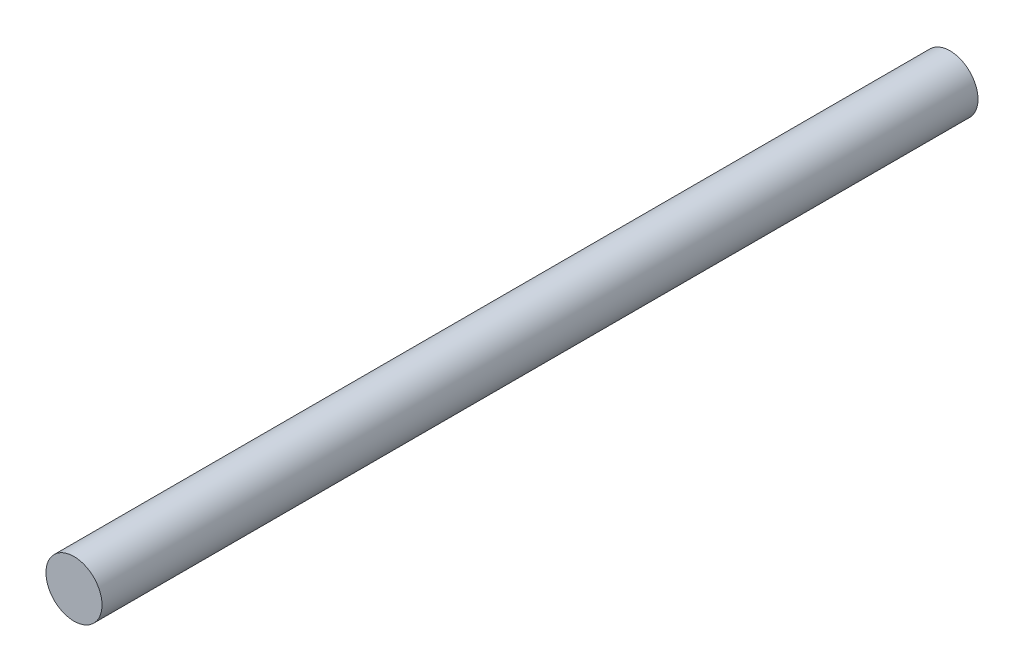
ISO-10303-21;
HEADER;
FILE_DESCRIPTION(('STEP AP214'),'2;1');
FILE_NAME('part.step','',(''),(''),'','','');
FILE_SCHEMA(('AUTOMOTIVE_DESIGN { 1 0 10303 214 1 1 1 1 }'));
ENDSEC;
DATA;
#1=APPLICATION_CONTEXT('core data for automotive mechanical design processes');
#2=APPLICATION_PROTOCOL_DEFINITION('international standard','automotive_design',2000,#1);
#3=PRODUCT_CONTEXT('',#1,'mechanical');
#4=PRODUCT('Part','Part','',(#3));
#5=PRODUCT_RELATED_PRODUCT_CATEGORY('part','',(#4));
#6=PRODUCT_DEFINITION_FORMATION('','',#4);
#7=PRODUCT_DEFINITION_CONTEXT('part definition',#1,'design');
#8=PRODUCT_DEFINITION('design','',#6,#7);
#9=PRODUCT_DEFINITION_SHAPE('','',#8);
#10=(LENGTH_UNIT() NAMED_UNIT(*) SI_UNIT(.MILLI.,.METRE.));
#11=(NAMED_UNIT(*) PLANE_ANGLE_UNIT() SI_UNIT($,.RADIAN.));
#12=(NAMED_UNIT(*) SI_UNIT($,.STERADIAN.) SOLID_ANGLE_UNIT());
#13=UNCERTAINTY_MEASURE_WITH_UNIT(LENGTH_MEASURE(1.E-05),#10,'distance_accuracy_value','');
#14=(GEOMETRIC_REPRESENTATION_CONTEXT(3) GLOBAL_UNCERTAINTY_ASSIGNED_CONTEXT((#13)) GLOBAL_UNIT_ASSIGNED_CONTEXT((#10,
#11,#12)) REPRESENTATION_CONTEXT('',''));
#15=CARTESIAN_POINT('',(0.,0.,0.));
#16=DIRECTION('',(0.,0.,1.));
#17=DIRECTION('',(1.,0.,0.));
#18=AXIS2_PLACEMENT_3D('',#15,#16,#17);
#19=CARTESIAN_POINT('',(0.,0.,50.));
#20=DIRECTION('',(0.,0.,-1.));
#21=DIRECTION('',(-1.,0.,0.));
#22=AXIS2_PLACEMENT_3D('',#19,#20,#21);
#23=CYLINDRICAL_SURFACE('',#22,1.6);
#24=CARTESIAN_POINT('',(0.,0.,50.));
#25=DIRECTION('',(0.,0.,1.));
#26=DIRECTION('',(1.,0.,0.));
#27=AXIS2_PLACEMENT_3D('',#24,#25,#26);
#28=CIRCLE('',#27,1.6);
#29=CARTESIAN_POINT('',(1.6,0.,50.));
#30=VERTEX_POINT('',#29);
#31=EDGE_CURVE('E10',#30,#30,#28,.T.);
#32=ORIENTED_EDGE('',*,*,#31,.F.);
#33=EDGE_LOOP('',(#32));
#34=FACE_BOUND('',#33,.T.);
#35=CARTESIAN_POINT('',(0.,0.,0.));
#36=DIRECTION('',(0.,0.,1.));
#37=DIRECTION('',(1.,0.,0.));
#38=AXIS2_PLACEMENT_3D('',#35,#36,#37);
#39=CIRCLE('',#38,1.6);
#40=CARTESIAN_POINT('',(1.6,0.,0.));
#41=VERTEX_POINT('',#40);
#42=EDGE_CURVE('E42',#41,#41,#39,.T.);
#43=ORIENTED_EDGE('',*,*,#42,.T.);
#44=EDGE_LOOP('',(#43));
#45=FACE_BOUND('',#44,.T.);
#46=ADVANCED_FACE('F39',(#34,#45),#23,.T.);
#47=CARTESIAN_POINT('',(0.,0.,50.));
#48=DIRECTION('',(0.,0.,1.));
#49=DIRECTION('',(1.,0.,0.));
#50=AXIS2_PLACEMENT_3D('',#47,#48,#49);
#51=PLANE('',#50);
#52=ORIENTED_EDGE('',*,*,#31,.T.);
#53=EDGE_LOOP('',(#52));
#54=FACE_BOUND('',#53,.T.);
#55=ADVANCED_FACE('F54',(#54),#51,.T.);
#56=CARTESIAN_POINT('',(0.,0.,0.));
#57=DIRECTION('',(0.,0.,1.));
#58=DIRECTION('',(1.,0.,0.));
#59=AXIS2_PLACEMENT_3D('',#56,#57,#58);
#60=PLANE('',#59);
#61=ORIENTED_EDGE('',*,*,#42,.F.);
#62=EDGE_LOOP('',(#61));
#63=FACE_BOUND('',#62,.T.);
#64=ADVANCED_FACE('F52',(#63),#60,.F.);
#65=CLOSED_SHELL('',(#46,#55,#64));
#66=MANIFOLD_SOLID_BREP('B2',#65);
#67=ADVANCED_BREP_SHAPE_REPRESENTATION('',(#18,#66),#14);
#68=SHAPE_DEFINITION_REPRESENTATION(#9,#67);
ENDSEC;
END-ISO-10303-21;
